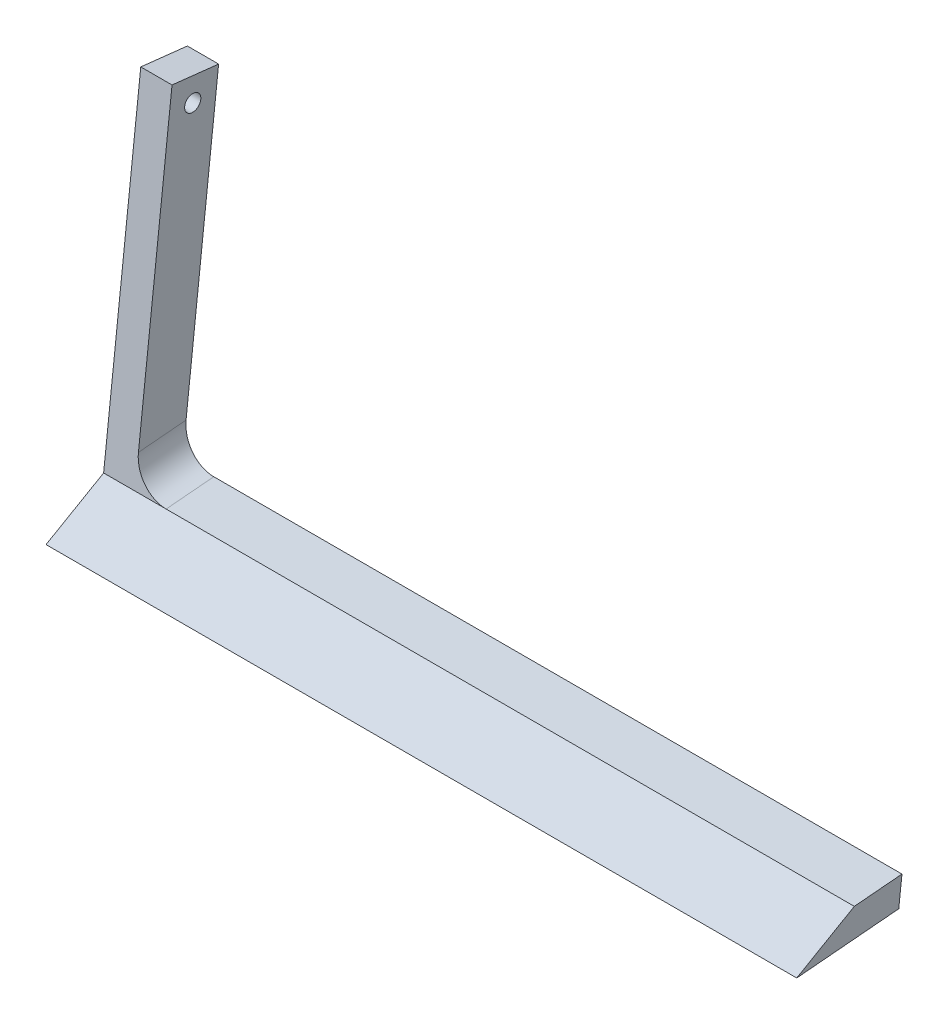
ISO-10303-21;
HEADER;
FILE_DESCRIPTION(('STEP AP214'),'2;1');
FILE_NAME('part.step','',(''),(''),'','','');
FILE_SCHEMA(('AUTOMOTIVE_DESIGN { 1 0 10303 214 1 1 1 1 }'));
ENDSEC;
DATA;
#1=APPLICATION_CONTEXT('core data for automotive mechanical design processes');
#2=APPLICATION_PROTOCOL_DEFINITION('international standard','automotive_design',2000,#1);
#3=PRODUCT_CONTEXT('',#1,'mechanical');
#4=PRODUCT('Part','Part','',(#3));
#5=PRODUCT_RELATED_PRODUCT_CATEGORY('part','',(#4));
#6=PRODUCT_DEFINITION_FORMATION('','',#4);
#7=PRODUCT_DEFINITION_CONTEXT('part definition',#1,'design');
#8=PRODUCT_DEFINITION('design','',#6,#7);
#9=PRODUCT_DEFINITION_SHAPE('','',#8);
#10=(LENGTH_UNIT() NAMED_UNIT(*) SI_UNIT(.MILLI.,.METRE.));
#11=(NAMED_UNIT(*) PLANE_ANGLE_UNIT() SI_UNIT($,.RADIAN.));
#12=(NAMED_UNIT(*) SI_UNIT($,.STERADIAN.) SOLID_ANGLE_UNIT());
#13=UNCERTAINTY_MEASURE_WITH_UNIT(LENGTH_MEASURE(1.E-05),#10,'distance_accuracy_value','');
#14=(GEOMETRIC_REPRESENTATION_CONTEXT(3) GLOBAL_UNCERTAINTY_ASSIGNED_CONTEXT((#13)) GLOBAL_UNIT_ASSIGNED_CONTEXT((#10,
#11,#12)) REPRESENTATION_CONTEXT('',''));
#15=CARTESIAN_POINT('',(0.,0.,0.));
#16=DIRECTION('',(0.,0.,1.));
#17=DIRECTION('',(1.,0.,0.));
#18=AXIS2_PLACEMENT_3D('',#15,#16,#17);
#19=CARTESIAN_POINT('',(6.10886628260686,363.884836728764,312.549454326368));
#20=DIRECTION('',(-1.,0.,0.));
#21=DIRECTION('',(0.,-1.,0.));
#22=AXIS2_PLACEMENT_3D('',#19,#20,#21);
#23=CYLINDRICAL_SURFACE('',#22,2.35);
#24=CARTESIAN_POINT('',(-0.241133717393143,363.884836728764,312.549454326368));
#25=DIRECTION('',(1.,0.,0.));
#26=DIRECTION('',(0.,1.,0.));
#27=AXIS2_PLACEMENT_3D('',#24,#25,#26);
#28=CIRCLE('',#27,2.35);
#29=CARTESIAN_POINT('',(-0.241133717393144,366.234836728764,312.549454326368));
#30=VERTEX_POINT('',#29);
#31=EDGE_CURVE('E152',#30,#30,#28,.T.);
#32=ORIENTED_EDGE('',*,*,#31,.F.);
#33=EDGE_LOOP('',(#32));
#34=FACE_BOUND('',#33,.T.);
#35=CARTESIAN_POINT('',(2.93386628260686,363.884836728764,312.549454326368));
#36=DIRECTION('',(1.,0.,0.));
#37=DIRECTION('',(0.,1.,0.));
#38=AXIS2_PLACEMENT_3D('',#35,#36,#37);
#39=CIRCLE('',#38,2.35);
#40=CARTESIAN_POINT('',(2.93386628260686,366.234836728764,312.549454326368));
#41=VERTEX_POINT('',#40);
#42=EDGE_CURVE('E140',#41,#41,#39,.T.);
#43=ORIENTED_EDGE('',*,*,#42,.T.);
#44=EDGE_LOOP('',(#43));
#45=FACE_BOUND('',#44,.T.);
#46=ADVANCED_FACE('F39',(#34,#45),#23,.F.);
#47=CARTESIAN_POINT('',(6.10886628260685,329.732901851281,-36.7612517386009));
#48=DIRECTION('',(0.,-0.993842557983309,0.110801488894298));
#49=DIRECTION('',(0.,-0.110801488894298,-0.993842557983309));
#50=AXIS2_PLACEMENT_3D('',#47,#48,#49);
#51=PLANE('',#50);
#52=DIRECTION('',(0.,0.110801488894298,0.993842557983309));
#53=VECTOR('',#52,1.);
#54=CARTESIAN_POINT('',(-0.241133717393147,329.732901851281,-36.7612517386009));
#55=LINE('',#54,#53);
#56=CARTESIAN_POINT('',(-0.241133717393144,368.0903198203,307.288587053113));
#57=VERTEX_POINT('',#56);
#58=CARTESIAN_POINT('',(-0.241133717393144,369.145704002018,316.754937417904));
#59=VERTEX_POINT('',#58);
#60=EDGE_CURVE('E131',#57,#59,#55,.T.);
#61=ORIENTED_EDGE('',*,*,#60,.T.);
#62=DIRECTION('',(-1.,0.,0.));
#63=VECTOR('',#62,1.);
#64=CARTESIAN_POINT('',(6.10886628260686,369.145704002018,316.754937417904));
#65=LINE('',#64,#63);
#66=CARTESIAN_POINT('',(6.10886628260686,369.145704002018,316.754937417904));
#67=VERTEX_POINT('',#66);
#68=EDGE_CURVE('E185',#67,#59,#65,.T.);
#69=ORIENTED_EDGE('',*,*,#68,.F.);
#70=DIRECTION('',(0.,0.110801488894298,0.993842557983309));
#71=VECTOR('',#70,1.);
#72=CARTESIAN_POINT('',(6.10886628260685,329.732901851281,-36.7612517386009));
#73=LINE('',#72,#71);
#74=CARTESIAN_POINT('',(6.10886628260686,368.0903198203,307.288587053113));
#75=VERTEX_POINT('',#74);
#76=EDGE_CURVE('E147',#75,#67,#73,.T.);
#77=ORIENTED_EDGE('',*,*,#76,.F.);
#78=DIRECTION('',(-1.,0.,0.));
#79=VECTOR('',#78,1.);
#80=CARTESIAN_POINT('',(6.10886628260686,368.0903198203,307.288587053113));
#81=LINE('',#80,#79);
#82=EDGE_CURVE('E157',#75,#57,#81,.T.);
#83=ORIENTED_EDGE('',*,*,#82,.T.);
#84=EDGE_LOOP('',(#61,#69,#77,#83));
#85=FACE_BOUND('',#84,.T.);
#86=ADVANCED_FACE('F212',(#85),#51,.F.);
#87=CARTESIAN_POINT('',(6.1088662826069,39.4128021507381,353.516189156505));
#88=DIRECTION('',(0.,-0.1108014888943,-0.993842557983309));
#89=DIRECTION('',(0.,0.993842557983309,-0.1108014888943));
#90=AXIS2_PLACEMENT_3D('',#87,#88,#89);
#91=PLANE('',#90);
#92=DIRECTION('',(0.,-0.993842557983309,0.1108014888943));
#93=VECTOR('',#92,1.);
#94=CARTESIAN_POINT('',(-0.241133717393097,39.4128021507381,353.516189156505));
#95=LINE('',#94,#93);
#96=CARTESIAN_POINT('',(-0.241133717393134,301.481270762538,324.29870769409));
#97=VERTEX_POINT('',#96);
#98=EDGE_CURVE('E136',#59,#97,#95,.T.);
#99=ORIENTED_EDGE('',*,*,#98,.T.);
#100=DIRECTION('',(-1.,0.,0.));
#101=VECTOR('',#100,1.);
#102=CARTESIAN_POINT('',(6.10886628260686,301.481270762538,324.29870769409));
#103=LINE('',#102,#101);
#104=CARTESIAN_POINT('',(12.4588662826068,301.481270762538,324.29870769409));
#105=VERTEX_POINT('',#104);
#106=EDGE_CURVE('E183',#105,#97,#103,.T.);
#107=ORIENTED_EDGE('',*,*,#106,.F.);
#108=CARTESIAN_POINT('',(12.4588662826068,307.918313214694,323.581054900853));
#109=DIRECTION('',(0.,-0.1108014888943,-0.993842557983309));
#110=DIRECTION('',(0.,-0.993842557983309,0.1108014888943));
#111=AXIS2_PLACEMENT_3D('',#108,#109,#110);
#112=ELLIPSE('',#111,6.47692373449793,6.35);
#113=CARTESIAN_POINT('',(6.10886628260686,307.918313214694,323.581054900853));
#114=VERTEX_POINT('',#113);
#115=EDGE_CURVE('E48',#105,#114,#112,.T.);
#116=ORIENTED_EDGE('',*,*,#115,.T.);
#117=DIRECTION('',(0.,-0.993842557983309,0.1108014888943));
#118=VECTOR('',#117,1.);
#119=CARTESIAN_POINT('',(6.1088662826069,39.4128021507381,353.516189156505));
#120=LINE('',#119,#118);
#121=EDGE_CURVE('E151',#67,#114,#120,.T.);
#122=ORIENTED_EDGE('',*,*,#121,.F.);
#123=ORIENTED_EDGE('',*,*,#68,.T.);
#124=EDGE_LOOP('',(#99,#107,#116,#122,#123));
#125=FACE_BOUND('',#124,.T.);
#126=ADVANCED_FACE('F213',(#125),#91,.F.);
#127=CARTESIAN_POINT('',(6.10886628260685,366.536412710678,211.619896546305));
#128=DIRECTION('',(0.,0.866025403784443,0.499999999999992));
#129=DIRECTION('',(0.,-0.499999999999993,0.866025403784443));
#130=AXIS2_PLACEMENT_3D('',#127,#128,#129);
#131=PLANE('',#130);
#132=DIRECTION('',(0.,0.499999999999993,-0.866025403784443));
#133=VECTOR('',#132,1.);
#134=CARTESIAN_POINT('',(-0.241133717393146,366.536412710678,211.619896546305));
#135=LINE('',#134,#133);
#136=CARTESIAN_POINT('',(-0.241133717393133,294.726836728763,335.997730616961));
#137=VERTEX_POINT('',#136);
#138=EDGE_CURVE('E162',#137,#97,#135,.T.);
#139=ORIENTED_EDGE('',*,*,#138,.F.);
#140=DIRECTION('',(-1.,0.,0.));
#141=VECTOR('',#140,1.);
#142=CARTESIAN_POINT('',(6.10886628260687,294.726836728763,335.997730616961));
#143=LINE('',#142,#141);
#144=CARTESIAN_POINT('',(152.258866282607,294.726836728763,335.997730616961));
#145=VERTEX_POINT('',#144);
#146=EDGE_CURVE('E180',#145,#137,#143,.T.);
#147=ORIENTED_EDGE('',*,*,#146,.F.);
#148=DIRECTION('',(0.,-0.499999999999997,0.86602540378444));
#149=VECTOR('',#148,1.);
#150=CARTESIAN_POINT('',(152.258866282607,294.726836728763,335.997730616961));
#151=LINE('',#150,#149);
#152=CARTESIAN_POINT('',(152.258866282607,301.481270762538,324.29870769409));
#153=VERTEX_POINT('',#152);
#154=EDGE_CURVE('E125',#153,#145,#151,.T.);
#155=ORIENTED_EDGE('',*,*,#154,.F.);
#156=DIRECTION('',(-1.,0.,0.));
#157=VECTOR('',#156,1.);
#158=CARTESIAN_POINT('',(174.947473615335,301.481270762538,324.29870769409));
#159=LINE('',#158,#157);
#160=EDGE_CURVE('E116',#153,#105,#159,.T.);
#161=ORIENTED_EDGE('',*,*,#160,.T.);
#162=ORIENTED_EDGE('',*,*,#106,.T.);
#163=EDGE_LOOP('',(#139,#147,#155,#161,#162));
#164=FACE_BOUND('',#163,.T.);
#165=ADVANCED_FACE('F201',(#164),#131,.T.);
#166=CARTESIAN_POINT('',(6.10886628260686,321.660752090936,28.14166930918));
#167=DIRECTION('',(0.,-0.996194698091745,-0.0871557427476593));
#168=DIRECTION('',(0.,0.0871557427476593,-0.996194698091745));
#169=AXIS2_PLACEMENT_3D('',#166,#167,#168);
#170=PLANE('',#169);
#171=DIRECTION('',(0.,-0.0871557427476593,0.996194698091745));
#172=VECTOR('',#171,1.);
#173=CARTESIAN_POINT('',(-0.241133717393144,321.660752090936,28.14166930918));
#174=LINE('',#173,#172);
#175=CARTESIAN_POINT('',(-0.241133717393134,296.540670814668,315.265512146536));
#176=VERTEX_POINT('',#175);
#177=EDGE_CURVE('E165',#176,#137,#174,.T.);
#178=ORIENTED_EDGE('',*,*,#177,.F.);
#179=DIRECTION('',(-1.,0.,0.));
#180=VECTOR('',#179,1.);
#181=CARTESIAN_POINT('',(6.10886628260687,296.540670814668,315.265512146536));
#182=LINE('',#181,#180);
#183=CARTESIAN_POINT('',(152.258866282607,296.540670814668,315.265512146536));
#184=VERTEX_POINT('',#183);
#185=EDGE_CURVE('E177',#184,#176,#182,.T.);
#186=ORIENTED_EDGE('',*,*,#185,.F.);
#187=DIRECTION('',(0.,0.087155742747662,-0.996194698091745));
#188=VECTOR('',#187,1.);
#189=CARTESIAN_POINT('',(152.258866282607,296.540670814668,315.265512146536));
#190=LINE('',#189,#188);
#191=EDGE_CURVE('E129',#145,#184,#190,.T.);
#192=ORIENTED_EDGE('',*,*,#191,.F.);
#193=ORIENTED_EDGE('',*,*,#146,.T.);
#194=EDGE_LOOP('',(#178,#186,#192,#193));
#195=FACE_BOUND('',#194,.T.);
#196=ADVANCED_FACE('F204',(#195),#170,.T.);
#197=CARTESIAN_POINT('',(6.1088662826069,38.3574179690196,344.049838791714));
#198=DIRECTION('',(0.,0.110801488894299,0.993842557983309));
#199=DIRECTION('',(0.,-0.993842557983309,0.110801488894299));
#200=AXIS2_PLACEMENT_3D('',#197,#198,#199);
#201=PLANE('',#200);
#202=DIRECTION('',(0.,0.993842557983309,-0.110801488894299));
#203=VECTOR('',#202,1.);
#204=CARTESIAN_POINT('',(-0.241133717393097,38.3574179690196,344.049838791714));
#205=LINE('',#204,#203);
#206=EDGE_CURVE('E168',#176,#57,#205,.T.);
#207=ORIENTED_EDGE('',*,*,#206,.T.);
#208=ORIENTED_EDGE('',*,*,#82,.F.);
#209=DIRECTION('',(0.,0.993842557983309,-0.110801488894299));
#210=VECTOR('',#209,1.);
#211=CARTESIAN_POINT('',(6.1088662826069,38.3574179690196,344.049838791714));
#212=LINE('',#211,#210);
#213=CARTESIAN_POINT('',(6.10886628260686,308.765064862895,313.902639274476));
#214=VERTEX_POINT('',#213);
#215=EDGE_CURVE('E155',#214,#75,#212,.T.);
#216=ORIENTED_EDGE('',*,*,#215,.F.);
#217=CARTESIAN_POINT('',(12.4588662826068,308.765064862895,313.902639274476));
#218=DIRECTION('',(0.,0.110801488894299,0.993842557983309));
#219=DIRECTION('',(0.,-0.993842557983309,0.110801488894299));
#220=AXIS2_PLACEMENT_3D('',#217,#218,#219);
#221=ELLIPSE('',#220,6.47692373449793,6.35);
#222=CARTESIAN_POINT('',(12.4588662826068,302.328022410738,314.620292067713));
#223=VERTEX_POINT('',#222);
#224=EDGE_CURVE('E11',#214,#223,#221,.T.);
#225=ORIENTED_EDGE('',*,*,#224,.T.);
#226=DIRECTION('',(-1.,0.,0.));
#227=VECTOR('',#226,1.);
#228=CARTESIAN_POINT('',(174.947473615335,302.328022410738,314.620292067713));
#229=LINE('',#228,#227);
#230=CARTESIAN_POINT('',(152.258866282607,302.328022410738,314.620292067713));
#231=VERTEX_POINT('',#230);
#232=EDGE_CURVE('E103',#231,#223,#229,.T.);
#233=ORIENTED_EDGE('',*,*,#232,.F.);
#234=DIRECTION('',(0.,0.993842557983309,-0.110801488894295));
#235=VECTOR('',#234,1.);
#236=CARTESIAN_POINT('',(152.258866282607,296.540670814668,315.265512146536));
#237=LINE('',#236,#235);
#238=EDGE_CURVE('E107',#184,#231,#237,.T.);
#239=ORIENTED_EDGE('',*,*,#238,.F.);
#240=ORIENTED_EDGE('',*,*,#185,.T.);
#241=EDGE_LOOP('',(#207,#208,#216,#225,#233,#239,#240));
#242=FACE_BOUND('',#241,.T.);
#243=ADVANCED_FACE('F105',(#242),#201,.F.);
#244=CARTESIAN_POINT('',(6.1088662826069,0.,0.));
#245=DIRECTION('',(1.,0.,0.));
#246=DIRECTION('',(0.,1.,0.));
#247=AXIS2_PLACEMENT_3D('',#244,#245,#246);
#248=PLANE('',#247);
#249=ORIENTED_EDGE('',*,*,#121,.T.);
#250=DIRECTION('',(0.,-0.0871557427476615,0.996194698091745));
#251=VECTOR('',#250,1.);
#252=CARTESIAN_POINT('',(6.10886628260685,333.673957937022,29.1926886333166));
#253=LINE('',#252,#251);
#254=EDGE_CURVE('E191',#114,#214,#253,.F.);
#255=ORIENTED_EDGE('',*,*,#254,.T.);
#256=ORIENTED_EDGE('',*,*,#215,.T.);
#257=ORIENTED_EDGE('',*,*,#76,.T.);
#258=EDGE_LOOP('',(#249,#255,#256,#257));
#259=FACE_BOUND('',#258,.T.);
#260=CARTESIAN_POINT('',(6.10886628260686,363.884836728764,312.549454326368));
#261=DIRECTION('',(1.,0.,0.));
#262=DIRECTION('',(0.,1.,0.));
#263=AXIS2_PLACEMENT_3D('',#260,#261,#262);
#264=CIRCLE('',#263,1.64999999999999);
#265=CARTESIAN_POINT('',(6.10886628260686,365.534836728764,312.549454326368));
#266=VERTEX_POINT('',#265);
#267=EDGE_CURVE('E365',#266,#266,#264,.T.);
#268=ORIENTED_EDGE('',*,*,#267,.F.);
#269=EDGE_LOOP('',(#268));
#270=FACE_BOUND('',#269,.T.);
#271=ADVANCED_FACE('F194',(#259,#270),#248,.T.);
#272=CARTESIAN_POINT('',(-0.2411337173931,0.,0.));
#273=DIRECTION('',(1.,0.,0.));
#274=DIRECTION('',(0.,1.,0.));
#275=AXIS2_PLACEMENT_3D('',#272,#273,#274);
#276=PLANE('',#275);
#277=ORIENTED_EDGE('',*,*,#60,.F.);
#278=ORIENTED_EDGE('',*,*,#206,.F.);
#279=ORIENTED_EDGE('',*,*,#177,.T.);
#280=ORIENTED_EDGE('',*,*,#138,.T.);
#281=ORIENTED_EDGE('',*,*,#98,.F.);
#282=EDGE_LOOP('',(#277,#278,#279,#280,#281));
#283=FACE_BOUND('',#282,.T.);
#284=ORIENTED_EDGE('',*,*,#31,.T.);
#285=EDGE_LOOP('',(#284));
#286=FACE_BOUND('',#285,.T.);
#287=ADVANCED_FACE('F208',(#283,#286),#276,.F.);
#288=CARTESIAN_POINT('',(174.947473615335,301.481270762538,324.29870769409));
#289=DIRECTION('',(0.,-0.996194698091745,-0.0871557427476615));
#290=DIRECTION('',(0.,0.0871557427476615,-0.996194698091745));
#291=AXIS2_PLACEMENT_3D('',#288,#289,#290);
#292=PLANE('',#291);
#293=ORIENTED_EDGE('',*,*,#232,.T.);
#294=DIRECTION('',(0.,-0.0871557427476615,0.996194698091745));
#295=VECTOR('',#294,1.);
#296=CARTESIAN_POINT('',(12.4588662826068,301.481270762538,324.29870769409));
#297=LINE('',#296,#295);
#298=EDGE_CURVE('E189',#223,#105,#297,.T.);
#299=ORIENTED_EDGE('',*,*,#298,.T.);
#300=ORIENTED_EDGE('',*,*,#160,.F.);
#301=DIRECTION('',(0.,-0.0871557427476615,0.996194698091745));
#302=VECTOR('',#301,1.);
#303=CARTESIAN_POINT('',(152.258866282607,301.481270762538,324.29870769409));
#304=LINE('',#303,#302);
#305=EDGE_CURVE('E115',#231,#153,#304,.T.);
#306=ORIENTED_EDGE('',*,*,#305,.F.);
#307=EDGE_LOOP('',(#293,#299,#300,#306));
#308=FACE_BOUND('',#307,.T.);
#309=ADVANCED_FACE('F119',(#308),#292,.F.);
#310=CARTESIAN_POINT('',(152.258866282607,-1.21032750683239E-13,0.));
#311=DIRECTION('',(1.,0.,0.));
#312=DIRECTION('',(0.,1.,0.));
#313=AXIS2_PLACEMENT_3D('',#310,#311,#312);
#314=PLANE('',#313);
#315=ORIENTED_EDGE('',*,*,#305,.T.);
#316=ORIENTED_EDGE('',*,*,#154,.T.);
#317=ORIENTED_EDGE('',*,*,#191,.T.);
#318=ORIENTED_EDGE('',*,*,#238,.T.);
#319=EDGE_LOOP('',(#315,#316,#317,#318));
#320=FACE_BOUND('',#319,.T.);
#321=ADVANCED_FACE('F127',(#320),#314,.T.);
#322=CARTESIAN_POINT('',(12.4588662826068,307.807107095421,324.852146660538));
#323=DIRECTION('',(0.,-0.0871557427476615,0.996194698091745));
#324=DIRECTION('',(0.,-0.996194698091745,-0.0871557427476615));
#325=AXIS2_PLACEMENT_3D('',#322,#323,#324);
#326=CYLINDRICAL_SURFACE('',#325,6.35);
#327=ORIENTED_EDGE('',*,*,#224,.F.);
#328=ORIENTED_EDGE('',*,*,#254,.F.);
#329=ORIENTED_EDGE('',*,*,#115,.F.);
#330=ORIENTED_EDGE('',*,*,#298,.F.);
#331=EDGE_LOOP('',(#327,#328,#329,#330));
#332=FACE_BOUND('',#331,.T.);
#333=ADVANCED_FACE('F41',(#332),#326,.F.);
#334=CARTESIAN_POINT('',(2.93386628260686,363.884836728764,312.549454326368));
#335=DIRECTION('',(1.,0.,0.));
#336=DIRECTION('',(0.,1.,0.));
#337=AXIS2_PLACEMENT_3D('',#334,#335,#336);
#338=PLANE('',#337);
#339=CARTESIAN_POINT('',(2.93386628260686,363.884836728764,312.549454326368));
#340=DIRECTION('',(1.,0.,0.));
#341=DIRECTION('',(0.,1.,0.));
#342=AXIS2_PLACEMENT_3D('',#339,#340,#341);
#343=CIRCLE('',#342,1.64999999999999);
#344=CARTESIAN_POINT('',(2.93386628260686,365.534836728764,312.549454326368));
#345=VERTEX_POINT('',#344);
#346=EDGE_CURVE('E362',#345,#345,#343,.T.);
#347=ORIENTED_EDGE('',*,*,#346,.T.);
#348=EDGE_LOOP('',(#347));
#349=FACE_BOUND('',#348,.T.);
#350=ORIENTED_EDGE('',*,*,#42,.F.);
#351=EDGE_LOOP('',(#350));
#352=FACE_BOUND('',#351,.T.);
#353=ADVANCED_FACE('F272',(#349,#352),#338,.F.);
#354=CARTESIAN_POINT('',(2.93386628260686,363.884836728764,312.549454326368));
#355=DIRECTION('',(1.,0.,0.));
#356=DIRECTION('',(0.,1.,0.));
#357=AXIS2_PLACEMENT_3D('',#354,#355,#356);
#358=CYLINDRICAL_SURFACE('',#357,1.64999999999999);
#359=ORIENTED_EDGE('',*,*,#346,.F.);
#360=EDGE_LOOP('',(#359));
#361=FACE_BOUND('',#360,.T.);
#362=ORIENTED_EDGE('',*,*,#267,.T.);
#363=EDGE_LOOP('',(#362));
#364=FACE_BOUND('',#363,.T.);
#365=ADVANCED_FACE('F277',(#361,#364),#358,.F.);
#366=CLOSED_SHELL('',(#46,#86,#126,#165,#196,#243,#271,#287,#309,#321,#333,#353,#365));
#367=MANIFOLD_SOLID_BREP('B2',#366);
#368=ADVANCED_BREP_SHAPE_REPRESENTATION('',(#18,#367),#14);
#369=SHAPE_DEFINITION_REPRESENTATION(#9,#368);
ENDSEC;
END-ISO-10303-21;
